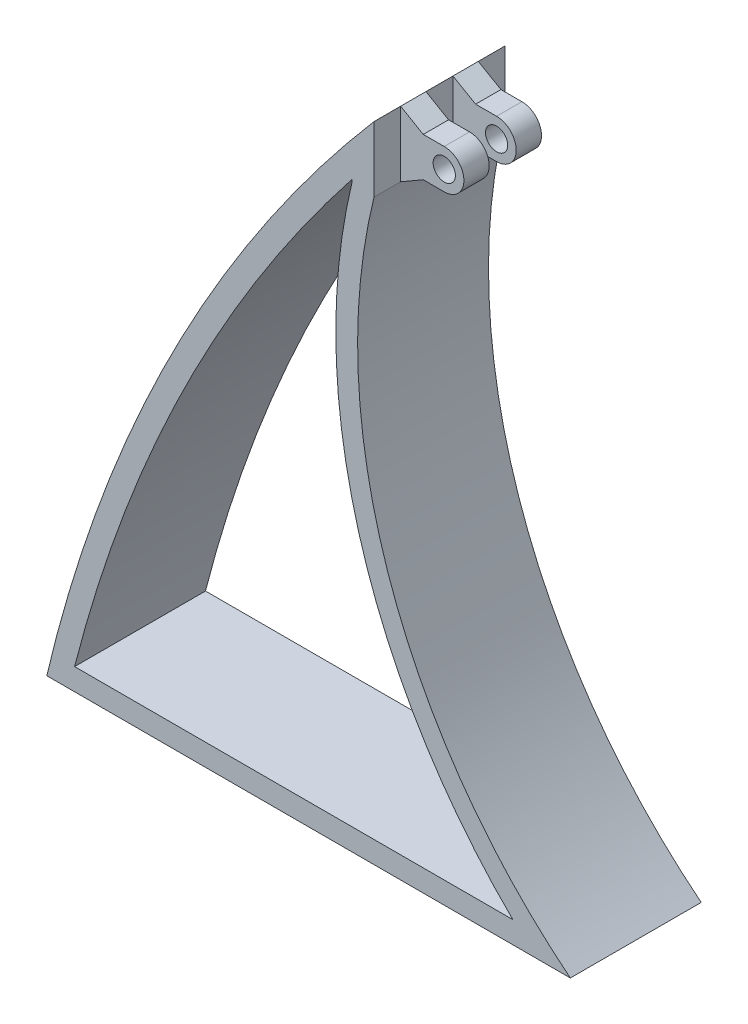
ISO-10303-21;
HEADER;
FILE_DESCRIPTION(('STEP AP214'),'2;1');
FILE_NAME('part.step','',(''),(''),'','','');
FILE_SCHEMA(('AUTOMOTIVE_DESIGN { 1 0 10303 214 1 1 1 1 }'));
ENDSEC;
DATA;
#1=APPLICATION_CONTEXT('core data for automotive mechanical design processes');
#2=APPLICATION_PROTOCOL_DEFINITION('international standard','automotive_design',2000,#1);
#3=PRODUCT_CONTEXT('',#1,'mechanical');
#4=PRODUCT('Part','Part','',(#3));
#5=PRODUCT_RELATED_PRODUCT_CATEGORY('part','',(#4));
#6=PRODUCT_DEFINITION_FORMATION('','',#4);
#7=PRODUCT_DEFINITION_CONTEXT('part definition',#1,'design');
#8=PRODUCT_DEFINITION('design','',#6,#7);
#9=PRODUCT_DEFINITION_SHAPE('','',#8);
#10=(LENGTH_UNIT() NAMED_UNIT(*) SI_UNIT(.MILLI.,.METRE.));
#11=(NAMED_UNIT(*) PLANE_ANGLE_UNIT() SI_UNIT($,.RADIAN.));
#12=(NAMED_UNIT(*) SI_UNIT($,.STERADIAN.) SOLID_ANGLE_UNIT());
#13=UNCERTAINTY_MEASURE_WITH_UNIT(LENGTH_MEASURE(1.E-05),#10,'distance_accuracy_value','');
#14=(GEOMETRIC_REPRESENTATION_CONTEXT(3) GLOBAL_UNCERTAINTY_ASSIGNED_CONTEXT((#13)) GLOBAL_UNIT_ASSIGNED_CONTEXT((#10,
#11,#12)) REPRESENTATION_CONTEXT('',''));
#15=CARTESIAN_POINT('',(0.,0.,0.));
#16=DIRECTION('',(0.,0.,1.));
#17=DIRECTION('',(1.,0.,0.));
#18=AXIS2_PLACEMENT_3D('',#15,#16,#17);
#19=CARTESIAN_POINT('',(15.,0.,15.));
#20=DIRECTION('',(1.,0.,0.));
#21=DIRECTION('',(0.,1.,0.));
#22=AXIS2_PLACEMENT_3D('',#19,#20,#21);
#23=PLANE('',#22);
#24=DIRECTION('',(0.,0.,-1.));
#25=VECTOR('',#24,1.);
#26=CARTESIAN_POINT('',(15.,147.5,15.));
#27=LINE('',#26,#25);
#28=CARTESIAN_POINT('',(15.,147.5,-8.9));
#29=VERTEX_POINT('',#28);
#30=CARTESIAN_POINT('',(15.,147.5,-15.));
#31=VERTEX_POINT('',#30);
#32=EDGE_CURVE('E405',#29,#31,#27,.T.);
#33=ORIENTED_EDGE('',*,*,#32,.F.);
#34=DIRECTION('',(0.,-1.,0.));
#35=VECTOR('',#34,1.);
#36=CARTESIAN_POINT('',(15.,147.5,-8.9));
#37=LINE('',#36,#35);
#38=CARTESIAN_POINT('',(15.,132.5,-8.9));
#39=VERTEX_POINT('',#38);
#40=EDGE_CURVE('E60',#29,#39,#37,.T.);
#41=ORIENTED_EDGE('',*,*,#40,.T.);
#42=DIRECTION('',(0.,0.,-1.));
#43=VECTOR('',#42,1.);
#44=CARTESIAN_POINT('',(15.,132.5,15.));
#45=LINE('',#44,#43);
#46=CARTESIAN_POINT('',(15.,132.5,-15.));
#47=VERTEX_POINT('',#46);
#48=EDGE_CURVE('E53',#39,#47,#45,.T.);
#49=ORIENTED_EDGE('',*,*,#48,.T.);
#50=DIRECTION('',(0.,-1.,0.));
#51=VECTOR('',#50,1.);
#52=CARTESIAN_POINT('',(15.,0.,-15.));
#53=LINE('',#52,#51);
#54=EDGE_CURVE('E390',#31,#47,#53,.T.);
#55=ORIENTED_EDGE('',*,*,#54,.F.);
#56=EDGE_LOOP('',(#33,#41,#49,#55));
#57=FACE_BOUND('',#56,.T.);
#58=ADVANCED_FACE('F43',(#57),#23,.T.);
#59=CARTESIAN_POINT('',(15.,132.5,15.));
#60=VERTEX_POINT('',#59);
#61=CARTESIAN_POINT('',(15.,132.5,8.9));
#62=VERTEX_POINT('',#61);
#63=EDGE_CURVE('E11',#60,#62,#45,.T.);
#64=ORIENTED_EDGE('',*,*,#63,.T.);
#65=DIRECTION('',(0.,-1.,0.));
#66=VECTOR('',#65,1.);
#67=CARTESIAN_POINT('',(15.,147.5,8.9));
#68=LINE('',#67,#66);
#69=CARTESIAN_POINT('',(15.,147.5,8.9));
#70=VERTEX_POINT('',#69);
#71=EDGE_CURVE('E271',#70,#62,#68,.T.);
#72=ORIENTED_EDGE('',*,*,#71,.F.);
#73=CARTESIAN_POINT('',(15.,147.5,15.));
#74=VERTEX_POINT('',#73);
#75=EDGE_CURVE('E406',#74,#70,#27,.T.);
#76=ORIENTED_EDGE('',*,*,#75,.F.);
#77=DIRECTION('',(0.,-1.,0.));
#78=VECTOR('',#77,1.);
#79=CARTESIAN_POINT('',(15.,0.,15.));
#80=LINE('',#79,#78);
#81=EDGE_CURVE('E375',#74,#60,#80,.T.);
#82=ORIENTED_EDGE('',*,*,#81,.T.);
#83=EDGE_LOOP('',(#64,#72,#76,#82));
#84=FACE_BOUND('',#83,.T.);
#85=ADVANCED_FACE('F437',(#84),#23,.T.);
#86=CARTESIAN_POINT('',(141.245938029767,101.484469519544,15.));
#87=DIRECTION('',(0.,0.,-1.));
#88=DIRECTION('',(-1.,0.,0.));
#89=AXIS2_PLACEMENT_3D('',#86,#87,#88);
#90=CYLINDRICAL_SURFACE('',#89,130.);
#91=CARTESIAN_POINT('',(141.245938029767,101.484469519544,-15.));
#92=DIRECTION('',(0.,0.,1.));
#93=DIRECTION('',(1.,0.,0.));
#94=AXIS2_PLACEMENT_3D('',#91,#92,#93);
#95=CIRCLE('',#94,130.);
#96=CARTESIAN_POINT('',(60.,0.,-15.));
#97=VERTEX_POINT('',#96);
#98=EDGE_CURVE('E361',#47,#97,#95,.T.);
#99=ORIENTED_EDGE('',*,*,#98,.F.);
#100=ORIENTED_EDGE('',*,*,#48,.F.);
#101=DIRECTION('',(0.,0.,1.));
#102=VECTOR('',#101,1.);
#103=CARTESIAN_POINT('',(15.,132.5,-8.9));
#104=LINE('',#103,#102);
#105=CARTESIAN_POINT('',(15.,132.5,-3.1));
#106=VERTEX_POINT('',#105);
#107=EDGE_CURVE('E249',#39,#106,#104,.T.);
#108=ORIENTED_EDGE('',*,*,#107,.T.);
#109=CARTESIAN_POINT('',(15.,132.5,3.1));
#110=VERTEX_POINT('',#109);
#111=EDGE_CURVE('E52',#110,#106,#45,.T.);
#112=ORIENTED_EDGE('',*,*,#111,.F.);
#113=DIRECTION('',(0.,0.,-1.));
#114=VECTOR('',#113,1.);
#115=CARTESIAN_POINT('',(15.,132.5,8.9));
#116=LINE('',#115,#114);
#117=EDGE_CURVE('E319',#62,#110,#116,.T.);
#118=ORIENTED_EDGE('',*,*,#117,.F.);
#119=ORIENTED_EDGE('',*,*,#63,.F.);
#120=CARTESIAN_POINT('',(141.245938029767,101.484469519544,15.));
#121=DIRECTION('',(0.,0.,1.));
#122=DIRECTION('',(1.,0.,0.));
#123=AXIS2_PLACEMENT_3D('',#120,#121,#122);
#124=CIRCLE('',#123,130.);
#125=CARTESIAN_POINT('',(60.,0.,15.));
#126=VERTEX_POINT('',#125);
#127=EDGE_CURVE('E371',#60,#126,#124,.T.);
#128=ORIENTED_EDGE('',*,*,#127,.T.);
#129=DIRECTION('',(0.,0.,-1.));
#130=VECTOR('',#129,1.);
#131=CARTESIAN_POINT('',(60.,0.,15.));
#132=LINE('',#131,#130);
#133=EDGE_CURVE('E386',#126,#97,#132,.T.);
#134=ORIENTED_EDGE('',*,*,#133,.T.);
#135=EDGE_LOOP('',(#99,#100,#108,#112,#118,#119,#128,#134));
#136=FACE_BOUND('',#135,.T.);
#137=ADVANCED_FACE('F45',(#136),#90,.F.);
#138=DIRECTION('',(0.,-1.,0.));
#139=VECTOR('',#138,1.);
#140=CARTESIAN_POINT('',(15.,147.5,-3.1));
#141=LINE('',#140,#139);
#142=CARTESIAN_POINT('',(15.,147.5,-3.1));
#143=VERTEX_POINT('',#142);
#144=EDGE_CURVE('E205',#143,#106,#141,.T.);
#145=ORIENTED_EDGE('',*,*,#144,.F.);
#146=CARTESIAN_POINT('',(15.,147.5,3.1));
#147=VERTEX_POINT('',#146);
#148=EDGE_CURVE('E409',#147,#143,#27,.T.);
#149=ORIENTED_EDGE('',*,*,#148,.F.);
#150=DIRECTION('',(0.,-1.,0.));
#151=VECTOR('',#150,1.);
#152=CARTESIAN_POINT('',(15.,147.5,3.1));
#153=LINE('',#152,#151);
#154=EDGE_CURVE('E290',#147,#110,#153,.T.);
#155=ORIENTED_EDGE('',*,*,#154,.T.);
#156=ORIENTED_EDGE('',*,*,#111,.T.);
#157=EDGE_LOOP('',(#145,#149,#155,#156));
#158=FACE_BOUND('',#157,.T.);
#159=ADVANCED_FACE('F455',(#158),#23,.T.);
#160=CARTESIAN_POINT('',(280.642623476707,-80.3903170220544,15.));
#161=DIRECTION('',(0.,0.,-1.));
#162=DIRECTION('',(-1.,0.,0.));
#163=AXIS2_PLACEMENT_3D('',#160,#161,#162);
#164=CYLINDRICAL_SURFACE('',#163,350.);
#165=CARTESIAN_POINT('',(280.642623476707,-80.3903170220544,-15.));
#166=DIRECTION('',(0.,0.,1.));
#167=DIRECTION('',(1.,0.,0.));
#168=AXIS2_PLACEMENT_3D('',#165,#166,#167);
#169=CIRCLE('',#168,350.);
#170=CARTESIAN_POINT('',(-60.,0.,-15.));
#171=VERTEX_POINT('',#170);
#172=EDGE_CURVE('E394',#31,#171,#169,.T.);
#173=ORIENTED_EDGE('',*,*,#172,.T.);
#174=DIRECTION('',(0.,0.,-1.));
#175=VECTOR('',#174,1.);
#176=CARTESIAN_POINT('',(-60.,0.,15.));
#177=LINE('',#176,#175);
#178=CARTESIAN_POINT('',(-60.,0.,15.));
#179=VERTEX_POINT('',#178);
#180=EDGE_CURVE('E402',#179,#171,#177,.T.);
#181=ORIENTED_EDGE('',*,*,#180,.F.);
#182=CARTESIAN_POINT('',(280.642623476707,-80.3903170220544,15.));
#183=DIRECTION('',(0.,0.,1.));
#184=DIRECTION('',(1.,0.,0.));
#185=AXIS2_PLACEMENT_3D('',#182,#183,#184);
#186=CIRCLE('',#185,350.);
#187=EDGE_CURVE('E380',#74,#179,#186,.T.);
#188=ORIENTED_EDGE('',*,*,#187,.F.);
#189=ORIENTED_EDGE('',*,*,#75,.T.);
#190=DIRECTION('',(0.,0.,-1.));
#191=VECTOR('',#190,1.);
#192=CARTESIAN_POINT('',(15.,147.5,8.9));
#193=LINE('',#192,#191);
#194=EDGE_CURVE('E322',#70,#147,#193,.T.);
#195=ORIENTED_EDGE('',*,*,#194,.T.);
#196=ORIENTED_EDGE('',*,*,#148,.T.);
#197=DIRECTION('',(0.,0.,1.));
#198=VECTOR('',#197,1.);
#199=CARTESIAN_POINT('',(15.,147.5,-8.9));
#200=LINE('',#199,#198);
#201=EDGE_CURVE('E225',#29,#143,#200,.T.);
#202=ORIENTED_EDGE('',*,*,#201,.F.);
#203=ORIENTED_EDGE('',*,*,#32,.T.);
#204=EDGE_LOOP('',(#173,#181,#188,#189,#195,#196,#202,#203));
#205=FACE_BOUND('',#204,.T.);
#206=ADVANCED_FACE('F418',(#205),#164,.T.);
#207=CARTESIAN_POINT('',(0.,0.,15.));
#208=DIRECTION('',(0.,1.,0.));
#209=DIRECTION('',(0.,0.,1.));
#210=AXIS2_PLACEMENT_3D('',#207,#208,#209);
#211=PLANE('',#210);
#212=DIRECTION('',(1.,0.,0.));
#213=VECTOR('',#212,1.);
#214=CARTESIAN_POINT('',(0.,0.,-15.));
#215=LINE('',#214,#213);
#216=EDGE_CURVE('E376',#171,#97,#215,.T.);
#217=ORIENTED_EDGE('',*,*,#216,.T.);
#218=ORIENTED_EDGE('',*,*,#133,.F.);
#219=DIRECTION('',(1.,0.,0.));
#220=VECTOR('',#219,1.);
#221=CARTESIAN_POINT('',(0.,0.,15.));
#222=LINE('',#221,#220);
#223=EDGE_CURVE('E383',#179,#126,#222,.T.);
#224=ORIENTED_EDGE('',*,*,#223,.F.);
#225=ORIENTED_EDGE('',*,*,#180,.T.);
#226=EDGE_LOOP('',(#217,#218,#224,#225));
#227=FACE_BOUND('',#226,.T.);
#228=ADVANCED_FACE('F432',(#227),#211,.F.);
#229=CARTESIAN_POINT('',(0.,0.,15.));
#230=DIRECTION('',(0.,0.,1.));
#231=DIRECTION('',(1.,0.,0.));
#232=AXIS2_PLACEMENT_3D('',#229,#230,#231);
#233=PLANE('',#232);
#234=CARTESIAN_POINT('',(141.245938029767,101.484469519544,15.));
#235=DIRECTION('',(0.,0.,-1.));
#236=DIRECTION('',(1.,0.,0.));
#237=AXIS2_PLACEMENT_3D('',#234,#235,#236);
#238=CIRCLE('',#237,135.);
#239=CARTESIAN_POINT('',(46.8227039105516,5.,15.));
#240=VERTEX_POINT('',#239);
#241=CARTESIAN_POINT('',(9.99999999999998,133.099398756954,15.));
#242=VERTEX_POINT('',#241);
#243=EDGE_CURVE('E326',#240,#242,#238,.T.);
#244=ORIENTED_EDGE('',*,*,#243,.F.);
#245=DIRECTION('',(1.,0.,0.));
#246=VECTOR('',#245,1.);
#247=CARTESIAN_POINT('',(-53.6229801364572,5.,15.));
#248=LINE('',#247,#246);
#249=CARTESIAN_POINT('',(-53.6229801364572,4.99999999999995,15.));
#250=VERTEX_POINT('',#249);
#251=EDGE_CURVE('E332',#250,#240,#248,.T.);
#252=ORIENTED_EDGE('',*,*,#251,.F.);
#253=CARTESIAN_POINT('',(280.642623476707,-80.3903170220544,15.));
#254=DIRECTION('',(0.,0.,1.));
#255=DIRECTION('',(1.,0.,0.));
#256=AXIS2_PLACEMENT_3D('',#253,#254,#255);
#257=CIRCLE('',#256,345.);
#258=CARTESIAN_POINT('',(9.99999999999998,133.56661873289,15.));
#259=VERTEX_POINT('',#258);
#260=EDGE_CURVE('E351',#259,#250,#257,.T.);
#261=ORIENTED_EDGE('',*,*,#260,.F.);
#262=DIRECTION('',(0.,1.,0.));
#263=VECTOR('',#262,1.);
#264=CARTESIAN_POINT('',(9.99999999999998,133.099398756954,15.));
#265=LINE('',#264,#263);
#266=EDGE_CURVE('E347',#242,#259,#265,.T.);
#267=ORIENTED_EDGE('',*,*,#266,.F.);
#268=EDGE_LOOP('',(#244,#252,#261,#267));
#269=FACE_BOUND('',#268,.T.);
#270=ORIENTED_EDGE('',*,*,#127,.F.);
#271=ORIENTED_EDGE('',*,*,#81,.F.);
#272=ORIENTED_EDGE('',*,*,#187,.T.);
#273=ORIENTED_EDGE('',*,*,#223,.T.);
#274=EDGE_LOOP('',(#270,#271,#272,#273));
#275=FACE_BOUND('',#274,.T.);
#276=ADVANCED_FACE('F435',(#269,#275),#233,.T.);
#277=CARTESIAN_POINT('',(0.,0.,-15.));
#278=DIRECTION('',(0.,0.,1.));
#279=DIRECTION('',(1.,0.,0.));
#280=AXIS2_PLACEMENT_3D('',#277,#278,#279);
#281=PLANE('',#280);
#282=DIRECTION('',(1.,0.,0.));
#283=VECTOR('',#282,1.);
#284=CARTESIAN_POINT('',(-53.6229801364572,5.,-15.));
#285=LINE('',#284,#283);
#286=CARTESIAN_POINT('',(-53.6229801364572,4.99999999999995,-15.));
#287=VERTEX_POINT('',#286);
#288=CARTESIAN_POINT('',(46.8227039105516,5.,-15.));
#289=VERTEX_POINT('',#288);
#290=EDGE_CURVE('E340',#287,#289,#285,.T.);
#291=ORIENTED_EDGE('',*,*,#290,.T.);
#292=CARTESIAN_POINT('',(141.245938029767,101.484469519544,-15.));
#293=DIRECTION('',(0.,0.,-1.));
#294=DIRECTION('',(1.,0.,0.));
#295=AXIS2_PLACEMENT_3D('',#292,#293,#294);
#296=CIRCLE('',#295,135.);
#297=CARTESIAN_POINT('',(9.99999999999998,133.099398756954,-15.));
#298=VERTEX_POINT('',#297);
#299=EDGE_CURVE('E327',#289,#298,#296,.T.);
#300=ORIENTED_EDGE('',*,*,#299,.T.);
#301=DIRECTION('',(0.,1.,0.));
#302=VECTOR('',#301,1.);
#303=CARTESIAN_POINT('',(9.99999999999998,133.099398756954,-15.));
#304=LINE('',#303,#302);
#305=CARTESIAN_POINT('',(9.99999999999998,133.56661873289,-15.));
#306=VERTEX_POINT('',#305);
#307=EDGE_CURVE('E331',#298,#306,#304,.T.);
#308=ORIENTED_EDGE('',*,*,#307,.T.);
#309=CARTESIAN_POINT('',(280.642623476707,-80.3903170220544,-15.));
#310=DIRECTION('',(0.,0.,1.));
#311=DIRECTION('',(1.,0.,0.));
#312=AXIS2_PLACEMENT_3D('',#309,#310,#311);
#313=CIRCLE('',#312,345.);
#314=EDGE_CURVE('E336',#306,#287,#313,.T.);
#315=ORIENTED_EDGE('',*,*,#314,.T.);
#316=EDGE_LOOP('',(#291,#300,#308,#315));
#317=FACE_BOUND('',#316,.T.);
#318=ORIENTED_EDGE('',*,*,#98,.T.);
#319=ORIENTED_EDGE('',*,*,#216,.F.);
#320=ORIENTED_EDGE('',*,*,#172,.F.);
#321=ORIENTED_EDGE('',*,*,#54,.T.);
#322=EDGE_LOOP('',(#318,#319,#320,#321));
#323=FACE_BOUND('',#322,.T.);
#324=ADVANCED_FACE('F424',(#317,#323),#281,.F.);
#325=CARTESIAN_POINT('',(141.245938029767,101.484469519544,-15.));
#326=DIRECTION('',(0.,0.,1.));
#327=DIRECTION('',(1.,0.,0.));
#328=AXIS2_PLACEMENT_3D('',#325,#326,#327);
#329=CYLINDRICAL_SURFACE('',#328,135.);
#330=ORIENTED_EDGE('',*,*,#243,.T.);
#331=DIRECTION('',(0.,0.,1.));
#332=VECTOR('',#331,1.);
#333=CARTESIAN_POINT('',(9.99999999999998,133.099398756954,-15.));
#334=LINE('',#333,#332);
#335=EDGE_CURVE('E344',#298,#242,#334,.T.);
#336=ORIENTED_EDGE('',*,*,#335,.F.);
#337=ORIENTED_EDGE('',*,*,#299,.F.);
#338=DIRECTION('',(0.,0.,1.));
#339=VECTOR('',#338,1.);
#340=CARTESIAN_POINT('',(46.8227039105516,5.,-15.));
#341=LINE('',#340,#339);
#342=EDGE_CURVE('E358',#289,#240,#341,.T.);
#343=ORIENTED_EDGE('',*,*,#342,.T.);
#344=EDGE_LOOP('',(#330,#336,#337,#343));
#345=FACE_BOUND('',#344,.T.);
#346=ADVANCED_FACE('F689',(#345),#329,.T.);
#347=CARTESIAN_POINT('',(-53.6229801364572,5.,-15.));
#348=DIRECTION('',(0.,-1.,0.));
#349=DIRECTION('',(0.,0.,-1.));
#350=AXIS2_PLACEMENT_3D('',#347,#348,#349);
#351=PLANE('',#350);
#352=ORIENTED_EDGE('',*,*,#251,.T.);
#353=ORIENTED_EDGE('',*,*,#342,.F.);
#354=ORIENTED_EDGE('',*,*,#290,.F.);
#355=DIRECTION('',(0.,0.,1.));
#356=VECTOR('',#355,1.);
#357=CARTESIAN_POINT('',(-53.6229801364572,4.99999999999995,-15.));
#358=LINE('',#357,#356);
#359=EDGE_CURVE('E362',#287,#250,#358,.T.);
#360=ORIENTED_EDGE('',*,*,#359,.T.);
#361=EDGE_LOOP('',(#352,#353,#354,#360));
#362=FACE_BOUND('',#361,.T.);
#363=ADVANCED_FACE('F697',(#362),#351,.F.);
#364=CARTESIAN_POINT('',(280.642623476707,-80.3903170220544,-15.));
#365=DIRECTION('',(0.,0.,1.));
#366=DIRECTION('',(1.,0.,0.));
#367=AXIS2_PLACEMENT_3D('',#364,#365,#366);
#368=CYLINDRICAL_SURFACE('',#367,345.);
#369=ORIENTED_EDGE('',*,*,#260,.T.);
#370=ORIENTED_EDGE('',*,*,#359,.F.);
#371=ORIENTED_EDGE('',*,*,#314,.F.);
#372=DIRECTION('',(0.,0.,1.));
#373=VECTOR('',#372,1.);
#374=CARTESIAN_POINT('',(9.99999999999998,133.56661873289,-15.));
#375=LINE('',#374,#373);
#376=EDGE_CURVE('E365',#306,#259,#375,.T.);
#377=ORIENTED_EDGE('',*,*,#376,.T.);
#378=EDGE_LOOP('',(#369,#370,#371,#377));
#379=FACE_BOUND('',#378,.T.);
#380=ADVANCED_FACE('F705',(#379),#368,.F.);
#381=CARTESIAN_POINT('',(9.99999999999998,133.099398756954,-15.));
#382=DIRECTION('',(1.,0.,0.));
#383=DIRECTION('',(0.,0.,-1.));
#384=AXIS2_PLACEMENT_3D('',#381,#382,#383);
#385=PLANE('',#384);
#386=ORIENTED_EDGE('',*,*,#266,.T.);
#387=ORIENTED_EDGE('',*,*,#376,.F.);
#388=ORIENTED_EDGE('',*,*,#307,.F.);
#389=ORIENTED_EDGE('',*,*,#335,.T.);
#390=EDGE_LOOP('',(#386,#387,#388,#389));
#391=FACE_BOUND('',#390,.T.);
#392=ADVANCED_FACE('F508',(#391),#385,.F.);
#393=CARTESIAN_POINT('',(25.,140.,8.9));
#394=DIRECTION('',(0.,0.,-1.));
#395=DIRECTION('',(-1.,0.,0.));
#396=AXIS2_PLACEMENT_3D('',#393,#394,#395);
#397=PLANE('',#396);
#398=DIRECTION('',(-0.866025403784437,0.500000000000004,0.));
#399=VECTOR('',#398,1.);
#400=CARTESIAN_POINT('',(20.1961524227066,144.5,8.9));
#401=LINE('',#400,#399);
#402=CARTESIAN_POINT('',(20.1961524227066,144.5,8.9));
#403=VERTEX_POINT('',#402);
#404=EDGE_CURVE('E268',#403,#70,#401,.T.);
#405=ORIENTED_EDGE('',*,*,#404,.T.);
#406=ORIENTED_EDGE('',*,*,#71,.T.);
#407=DIRECTION('',(0.866025403784436,0.500000000000004,0.));
#408=VECTOR('',#407,1.);
#409=CARTESIAN_POINT('',(20.1961524227066,135.5,8.9));
#410=LINE('',#409,#408);
#411=CARTESIAN_POINT('',(20.1961524227066,135.5,8.9));
#412=VERTEX_POINT('',#411);
#413=EDGE_CURVE('E275',#62,#412,#410,.T.);
#414=ORIENTED_EDGE('',*,*,#413,.T.);
#415=DIRECTION('',(1.,0.,0.));
#416=VECTOR('',#415,1.);
#417=CARTESIAN_POINT('',(25.,135.5,8.9));
#418=LINE('',#417,#416);
#419=CARTESIAN_POINT('',(25.,135.5,8.9));
#420=VERTEX_POINT('',#419);
#421=EDGE_CURVE('E278',#412,#420,#418,.T.);
#422=ORIENTED_EDGE('',*,*,#421,.T.);
#423=CARTESIAN_POINT('',(25.,140.,8.9));
#424=DIRECTION('',(0.,0.,1.));
#425=DIRECTION('',(-1.,0.,0.));
#426=AXIS2_PLACEMENT_3D('',#423,#424,#425);
#427=CIRCLE('',#426,4.5);
#428=CARTESIAN_POINT('',(25.,144.5,8.9));
#429=VERTEX_POINT('',#428);
#430=EDGE_CURVE('E281',#420,#429,#427,.T.);
#431=ORIENTED_EDGE('',*,*,#430,.T.);
#432=DIRECTION('',(-1.,0.,0.));
#433=VECTOR('',#432,1.);
#434=CARTESIAN_POINT('',(25.,144.5,8.9));
#435=LINE('',#434,#433);
#436=EDGE_CURVE('E284',#429,#403,#435,.T.);
#437=ORIENTED_EDGE('',*,*,#436,.T.);
#438=EDGE_LOOP('',(#405,#406,#414,#422,#431,#437));
#439=FACE_BOUND('',#438,.T.);
#440=CARTESIAN_POINT('',(25.,140.,8.9));
#441=DIRECTION('',(0.,0.,1.));
#442=DIRECTION('',(1.,0.,0.));
#443=AXIS2_PLACEMENT_3D('',#440,#441,#442);
#444=CIRCLE('',#443,2.54999999999999);
#445=CARTESIAN_POINT('',(27.55,140.,8.9));
#446=VERTEX_POINT('',#445);
#447=EDGE_CURVE('E261',#446,#446,#444,.T.);
#448=ORIENTED_EDGE('',*,*,#447,.F.);
#449=EDGE_LOOP('',(#448));
#450=FACE_BOUND('',#449,.T.);
#451=ADVANCED_FACE('F441',(#439,#450),#397,.F.);
#452=CARTESIAN_POINT('',(25.,140.,3.1));
#453=DIRECTION('',(0.,0.,-1.));
#454=DIRECTION('',(-1.,0.,0.));
#455=AXIS2_PLACEMENT_3D('',#452,#453,#454);
#456=PLANE('',#455);
#457=DIRECTION('',(-0.866025403784437,0.500000000000004,0.));
#458=VECTOR('',#457,1.);
#459=CARTESIAN_POINT('',(20.1961524227066,144.5,3.1));
#460=LINE('',#459,#458);
#461=CARTESIAN_POINT('',(20.1961524227066,144.5,3.1));
#462=VERTEX_POINT('',#461);
#463=EDGE_CURVE('E68',#462,#147,#460,.T.);
#464=ORIENTED_EDGE('',*,*,#463,.F.);
#465=DIRECTION('',(-1.,0.,0.));
#466=VECTOR('',#465,1.);
#467=CARTESIAN_POINT('',(25.,144.5,3.1));
#468=LINE('',#467,#466);
#469=CARTESIAN_POINT('',(25.,144.5,3.1));
#470=VERTEX_POINT('',#469);
#471=EDGE_CURVE('E272',#470,#462,#468,.T.);
#472=ORIENTED_EDGE('',*,*,#471,.F.);
#473=CARTESIAN_POINT('',(25.,140.,3.1));
#474=DIRECTION('',(0.,0.,1.));
#475=DIRECTION('',(-1.,0.,0.));
#476=AXIS2_PLACEMENT_3D('',#473,#474,#475);
#477=CIRCLE('',#476,4.5);
#478=CARTESIAN_POINT('',(25.,135.5,3.1));
#479=VERTEX_POINT('',#478);
#480=EDGE_CURVE('E300',#479,#470,#477,.T.);
#481=ORIENTED_EDGE('',*,*,#480,.F.);
#482=DIRECTION('',(1.,0.,0.));
#483=VECTOR('',#482,1.);
#484=CARTESIAN_POINT('',(25.,135.5,3.1));
#485=LINE('',#484,#483);
#486=CARTESIAN_POINT('',(20.1961524227066,135.5,3.1));
#487=VERTEX_POINT('',#486);
#488=EDGE_CURVE('E297',#487,#479,#485,.T.);
#489=ORIENTED_EDGE('',*,*,#488,.F.);
#490=DIRECTION('',(0.866025403784436,0.500000000000004,0.));
#491=VECTOR('',#490,1.);
#492=CARTESIAN_POINT('',(20.1961524227066,135.5,3.1));
#493=LINE('',#492,#491);
#494=EDGE_CURVE('E294',#110,#487,#493,.T.);
#495=ORIENTED_EDGE('',*,*,#494,.F.);
#496=ORIENTED_EDGE('',*,*,#154,.F.);
#497=EDGE_LOOP('',(#464,#472,#481,#489,#495,#496));
#498=FACE_BOUND('',#497,.T.);
#499=CARTESIAN_POINT('',(25.,140.,3.1));
#500=DIRECTION('',(0.,0.,1.));
#501=DIRECTION('',(1.,0.,0.));
#502=AXIS2_PLACEMENT_3D('',#499,#500,#501);
#503=CIRCLE('',#502,2.54999999999999);
#504=CARTESIAN_POINT('',(27.55,140.,3.1));
#505=VERTEX_POINT('',#504);
#506=EDGE_CURVE('E196',#505,#505,#503,.T.);
#507=ORIENTED_EDGE('',*,*,#506,.T.);
#508=EDGE_LOOP('',(#507));
#509=FACE_BOUND('',#508,.T.);
#510=ADVANCED_FACE('F458',(#498,#509),#456,.T.);
#511=CARTESIAN_POINT('',(20.1961524227066,144.5,8.9));
#512=DIRECTION('',(-0.500000000000004,-0.866025403784436,0.));
#513=DIRECTION('',(0.866025403784437,-0.500000000000004,0.));
#514=AXIS2_PLACEMENT_3D('',#511,#512,#513);
#515=PLANE('',#514);
#516=ORIENTED_EDGE('',*,*,#463,.T.);
#517=ORIENTED_EDGE('',*,*,#194,.F.);
#518=ORIENTED_EDGE('',*,*,#404,.F.);
#519=DIRECTION('',(0.,0.,-1.));
#520=VECTOR('',#519,1.);
#521=CARTESIAN_POINT('',(20.1961524227066,144.5,8.9));
#522=LINE('',#521,#520);
#523=EDGE_CURVE('E287',#403,#462,#522,.T.);
#524=ORIENTED_EDGE('',*,*,#523,.T.);
#525=EDGE_LOOP('',(#516,#517,#518,#524));
#526=FACE_BOUND('',#525,.T.);
#527=ADVANCED_FACE('F474',(#526),#515,.F.);
#528=CARTESIAN_POINT('',(20.1961524227066,135.5,8.9));
#529=DIRECTION('',(-0.500000000000004,0.866025403784436,0.));
#530=DIRECTION('',(-0.866025403784436,-0.500000000000004,0.));
#531=AXIS2_PLACEMENT_3D('',#528,#529,#530);
#532=PLANE('',#531);
#533=ORIENTED_EDGE('',*,*,#494,.T.);
#534=DIRECTION('',(0.,0.,-1.));
#535=VECTOR('',#534,1.);
#536=CARTESIAN_POINT('',(20.1961524227066,135.5,8.9));
#537=LINE('',#536,#535);
#538=EDGE_CURVE('E315',#412,#487,#537,.T.);
#539=ORIENTED_EDGE('',*,*,#538,.F.);
#540=ORIENTED_EDGE('',*,*,#413,.F.);
#541=ORIENTED_EDGE('',*,*,#117,.T.);
#542=EDGE_LOOP('',(#533,#539,#540,#541));
#543=FACE_BOUND('',#542,.T.);
#544=ADVANCED_FACE('F447',(#543),#532,.F.);
#545=CARTESIAN_POINT('',(25.,135.5,8.9));
#546=DIRECTION('',(0.,1.,0.));
#547=DIRECTION('',(0.,0.,1.));
#548=AXIS2_PLACEMENT_3D('',#545,#546,#547);
#549=PLANE('',#548);
#550=ORIENTED_EDGE('',*,*,#488,.T.);
#551=DIRECTION('',(0.,0.,-1.));
#552=VECTOR('',#551,1.);
#553=CARTESIAN_POINT('',(25.,135.5,8.9));
#554=LINE('',#553,#552);
#555=EDGE_CURVE('E311',#420,#479,#554,.T.);
#556=ORIENTED_EDGE('',*,*,#555,.F.);
#557=ORIENTED_EDGE('',*,*,#421,.F.);
#558=ORIENTED_EDGE('',*,*,#538,.T.);
#559=EDGE_LOOP('',(#550,#556,#557,#558));
#560=FACE_BOUND('',#559,.T.);
#561=ADVANCED_FACE('F464',(#560),#549,.F.);
#562=CARTESIAN_POINT('',(25.,140.,8.9));
#563=DIRECTION('',(0.,0.,-1.));
#564=DIRECTION('',(-1.,0.,0.));
#565=AXIS2_PLACEMENT_3D('',#562,#563,#564);
#566=CYLINDRICAL_SURFACE('',#565,4.5);
#567=ORIENTED_EDGE('',*,*,#480,.T.);
#568=DIRECTION('',(0.,0.,-1.));
#569=VECTOR('',#568,1.);
#570=CARTESIAN_POINT('',(25.,144.5,8.9));
#571=LINE('',#570,#569);
#572=EDGE_CURVE('E307',#429,#470,#571,.T.);
#573=ORIENTED_EDGE('',*,*,#572,.F.);
#574=ORIENTED_EDGE('',*,*,#430,.F.);
#575=ORIENTED_EDGE('',*,*,#555,.T.);
#576=EDGE_LOOP('',(#567,#573,#574,#575));
#577=FACE_BOUND('',#576,.T.);
#578=ADVANCED_FACE('F471',(#577),#566,.T.);
#579=CARTESIAN_POINT('',(25.,144.5,8.9));
#580=DIRECTION('',(0.,-1.,0.));
#581=DIRECTION('',(0.,0.,-1.));
#582=AXIS2_PLACEMENT_3D('',#579,#580,#581);
#583=PLANE('',#582);
#584=ORIENTED_EDGE('',*,*,#471,.T.);
#585=ORIENTED_EDGE('',*,*,#523,.F.);
#586=ORIENTED_EDGE('',*,*,#436,.F.);
#587=ORIENTED_EDGE('',*,*,#572,.T.);
#588=EDGE_LOOP('',(#584,#585,#586,#587));
#589=FACE_BOUND('',#588,.T.);
#590=ADVANCED_FACE('F473',(#589),#583,.F.);
#591=CARTESIAN_POINT('',(25.,140.,8.9));
#592=DIRECTION('',(0.,0.,-1.));
#593=DIRECTION('',(-1.,0.,0.));
#594=AXIS2_PLACEMENT_3D('',#591,#592,#593);
#595=CYLINDRICAL_SURFACE('',#594,2.54999999999999);
#596=ORIENTED_EDGE('',*,*,#447,.T.);
#597=EDGE_LOOP('',(#596));
#598=FACE_BOUND('',#597,.T.);
#599=ORIENTED_EDGE('',*,*,#506,.F.);
#600=EDGE_LOOP('',(#599));
#601=FACE_BOUND('',#600,.T.);
#602=ADVANCED_FACE('F555',(#598,#601),#595,.F.);
#603=CARTESIAN_POINT('',(20.1961524227066,144.5,-8.9));
#604=DIRECTION('',(0.500000000000004,0.866025403784436,0.));
#605=DIRECTION('',(-0.866025403784437,0.500000000000004,0.));
#606=AXIS2_PLACEMENT_3D('',#603,#604,#605);
#607=PLANE('',#606);
#608=DIRECTION('',(-0.866025403784437,0.500000000000004,0.));
#609=VECTOR('',#608,1.);
#610=CARTESIAN_POINT('',(20.1961524227066,144.5,-3.1));
#611=LINE('',#610,#609);
#612=CARTESIAN_POINT('',(20.1961524227066,144.5,-3.1));
#613=VERTEX_POINT('',#612);
#614=EDGE_CURVE('E190',#613,#143,#611,.T.);
#615=ORIENTED_EDGE('',*,*,#614,.F.);
#616=DIRECTION('',(0.,0.,1.));
#617=VECTOR('',#616,1.);
#618=CARTESIAN_POINT('',(20.1961524227066,144.5,-8.9));
#619=LINE('',#618,#617);
#620=CARTESIAN_POINT('',(20.1961524227066,144.5,-8.9));
#621=VERTEX_POINT('',#620);
#622=EDGE_CURVE('E185',#621,#613,#619,.T.);
#623=ORIENTED_EDGE('',*,*,#622,.F.);
#624=DIRECTION('',(-0.866025403784437,0.500000000000004,0.));
#625=VECTOR('',#624,1.);
#626=CARTESIAN_POINT('',(20.1961524227066,144.5,-8.9));
#627=LINE('',#626,#625);
#628=EDGE_CURVE('E187',#621,#29,#627,.T.);
#629=ORIENTED_EDGE('',*,*,#628,.T.);
#630=ORIENTED_EDGE('',*,*,#201,.T.);
#631=EDGE_LOOP('',(#615,#623,#629,#630));
#632=FACE_BOUND('',#631,.T.);
#633=ADVANCED_FACE('F186',(#632),#607,.T.);
#634=CARTESIAN_POINT('',(25.,144.5,-8.9));
#635=DIRECTION('',(0.,1.,0.));
#636=DIRECTION('',(0.,0.,1.));
#637=AXIS2_PLACEMENT_3D('',#634,#635,#636);
#638=PLANE('',#637);
#639=DIRECTION('',(-1.,0.,0.));
#640=VECTOR('',#639,1.);
#641=CARTESIAN_POINT('',(25.,144.5,-3.1));
#642=LINE('',#641,#640);
#643=CARTESIAN_POINT('',(25.,144.5,-3.1));
#644=VERTEX_POINT('',#643);
#645=EDGE_CURVE('E228',#644,#613,#642,.T.);
#646=ORIENTED_EDGE('',*,*,#645,.F.);
#647=DIRECTION('',(0.,0.,1.));
#648=VECTOR('',#647,1.);
#649=CARTESIAN_POINT('',(25.,144.5,-8.9));
#650=LINE('',#649,#648);
#651=CARTESIAN_POINT('',(25.,144.5,-8.9));
#652=VERTEX_POINT('',#651);
#653=EDGE_CURVE('E197',#652,#644,#650,.T.);
#654=ORIENTED_EDGE('',*,*,#653,.F.);
#655=DIRECTION('',(-1.,0.,0.));
#656=VECTOR('',#655,1.);
#657=CARTESIAN_POINT('',(25.,144.5,-8.9));
#658=LINE('',#657,#656);
#659=EDGE_CURVE('E202',#652,#621,#658,.T.);
#660=ORIENTED_EDGE('',*,*,#659,.T.);
#661=ORIENTED_EDGE('',*,*,#622,.T.);
#662=EDGE_LOOP('',(#646,#654,#660,#661));
#663=FACE_BOUND('',#662,.T.);
#664=ADVANCED_FACE('F207',(#663),#638,.T.);
#665=CARTESIAN_POINT('',(25.,140.,-8.9));
#666=DIRECTION('',(0.,0.,1.));
#667=DIRECTION('',(1.,0.,0.));
#668=AXIS2_PLACEMENT_3D('',#665,#666,#667);
#669=CYLINDRICAL_SURFACE('',#668,4.5);
#670=CARTESIAN_POINT('',(25.,140.,-3.1));
#671=DIRECTION('',(0.,0.,1.));
#672=DIRECTION('',(-1.,0.,0.));
#673=AXIS2_PLACEMENT_3D('',#670,#671,#672);
#674=CIRCLE('',#673,4.5);
#675=CARTESIAN_POINT('',(25.,135.5,-3.1));
#676=VERTEX_POINT('',#675);
#677=EDGE_CURVE('E232',#676,#644,#674,.T.);
#678=ORIENTED_EDGE('',*,*,#677,.F.);
#679=DIRECTION('',(0.,0.,1.));
#680=VECTOR('',#679,1.);
#681=CARTESIAN_POINT('',(25.,135.5,-8.9));
#682=LINE('',#681,#680);
#683=CARTESIAN_POINT('',(25.,135.5,-8.9));
#684=VERTEX_POINT('',#683);
#685=EDGE_CURVE('E256',#684,#676,#682,.T.);
#686=ORIENTED_EDGE('',*,*,#685,.F.);
#687=CARTESIAN_POINT('',(25.,140.,-8.9));
#688=DIRECTION('',(0.,0.,1.));
#689=DIRECTION('',(-1.,0.,0.));
#690=AXIS2_PLACEMENT_3D('',#687,#688,#689);
#691=CIRCLE('',#690,4.5);
#692=EDGE_CURVE('E209',#684,#652,#691,.T.);
#693=ORIENTED_EDGE('',*,*,#692,.T.);
#694=ORIENTED_EDGE('',*,*,#653,.T.);
#695=EDGE_LOOP('',(#678,#686,#693,#694));
#696=FACE_BOUND('',#695,.T.);
#697=ADVANCED_FACE('F586',(#696),#669,.T.);
#698=CARTESIAN_POINT('',(25.,135.5,-8.9));
#699=DIRECTION('',(0.,-1.,0.));
#700=DIRECTION('',(0.,0.,-1.));
#701=AXIS2_PLACEMENT_3D('',#698,#699,#700);
#702=PLANE('',#701);
#703=DIRECTION('',(1.,0.,0.));
#704=VECTOR('',#703,1.);
#705=CARTESIAN_POINT('',(25.,135.5,-3.1));
#706=LINE('',#705,#704);
#707=CARTESIAN_POINT('',(20.1961524227066,135.5,-3.1));
#708=VERTEX_POINT('',#707);
#709=EDGE_CURVE('E236',#708,#676,#706,.T.);
#710=ORIENTED_EDGE('',*,*,#709,.F.);
#711=DIRECTION('',(0.,0.,1.));
#712=VECTOR('',#711,1.);
#713=CARTESIAN_POINT('',(20.1961524227066,135.5,-8.9));
#714=LINE('',#713,#712);
#715=CARTESIAN_POINT('',(20.1961524227066,135.5,-8.9));
#716=VERTEX_POINT('',#715);
#717=EDGE_CURVE('E253',#716,#708,#714,.T.);
#718=ORIENTED_EDGE('',*,*,#717,.F.);
#719=DIRECTION('',(1.,0.,0.));
#720=VECTOR('',#719,1.);
#721=CARTESIAN_POINT('',(25.,135.5,-8.9));
#722=LINE('',#721,#720);
#723=EDGE_CURVE('E212',#716,#684,#722,.T.);
#724=ORIENTED_EDGE('',*,*,#723,.T.);
#725=ORIENTED_EDGE('',*,*,#685,.T.);
#726=EDGE_LOOP('',(#710,#718,#724,#725));
#727=FACE_BOUND('',#726,.T.);
#728=ADVANCED_FACE('F594',(#727),#702,.T.);
#729=CARTESIAN_POINT('',(20.1961524227066,135.5,-8.9));
#730=DIRECTION('',(0.500000000000004,-0.866025403784436,0.));
#731=DIRECTION('',(0.866025403784436,0.500000000000004,0.));
#732=AXIS2_PLACEMENT_3D('',#729,#730,#731);
#733=PLANE('',#732);
#734=DIRECTION('',(0.866025403784436,0.500000000000004,0.));
#735=VECTOR('',#734,1.);
#736=CARTESIAN_POINT('',(20.1961524227066,135.5,-3.1));
#737=LINE('',#736,#735);
#738=EDGE_CURVE('E240',#106,#708,#737,.T.);
#739=ORIENTED_EDGE('',*,*,#738,.F.);
#740=ORIENTED_EDGE('',*,*,#107,.F.);
#741=DIRECTION('',(0.866025403784436,0.500000000000004,0.));
#742=VECTOR('',#741,1.);
#743=CARTESIAN_POINT('',(20.1961524227066,135.5,-8.9));
#744=LINE('',#743,#742);
#745=EDGE_CURVE('E219',#39,#716,#744,.T.);
#746=ORIENTED_EDGE('',*,*,#745,.T.);
#747=ORIENTED_EDGE('',*,*,#717,.T.);
#748=EDGE_LOOP('',(#739,#740,#746,#747));
#749=FACE_BOUND('',#748,.T.);
#750=ADVANCED_FACE('F603',(#749),#733,.T.);
#751=CARTESIAN_POINT('',(25.,140.,-8.9));
#752=DIRECTION('',(0.,0.,1.));
#753=DIRECTION('',(-1.,0.,0.));
#754=AXIS2_PLACEMENT_3D('',#751,#752,#753);
#755=PLANE('',#754);
#756=CARTESIAN_POINT('',(25.,140.,-8.9));
#757=DIRECTION('',(0.,0.,1.));
#758=DIRECTION('',(1.,0.,0.));
#759=AXIS2_PLACEMENT_3D('',#756,#757,#758);
#760=CIRCLE('',#759,2.54999999999999);
#761=CARTESIAN_POINT('',(27.55,140.,-8.9));
#762=VERTEX_POINT('',#761);
#763=EDGE_CURVE('E229',#762,#762,#760,.T.);
#764=ORIENTED_EDGE('',*,*,#763,.T.);
#765=EDGE_LOOP('',(#764));
#766=FACE_BOUND('',#765,.T.);
#767=ORIENTED_EDGE('',*,*,#628,.F.);
#768=ORIENTED_EDGE('',*,*,#659,.F.);
#769=ORIENTED_EDGE('',*,*,#692,.F.);
#770=ORIENTED_EDGE('',*,*,#723,.F.);
#771=ORIENTED_EDGE('',*,*,#745,.F.);
#772=ORIENTED_EDGE('',*,*,#40,.F.);
#773=EDGE_LOOP('',(#767,#768,#769,#770,#771,#772));
#774=FACE_BOUND('',#773,.T.);
#775=ADVANCED_FACE('F200',(#766,#774),#755,.F.);
#776=CARTESIAN_POINT('',(25.,140.,-3.1));
#777=DIRECTION('',(0.,0.,1.));
#778=DIRECTION('',(-1.,0.,0.));
#779=AXIS2_PLACEMENT_3D('',#776,#777,#778);
#780=PLANE('',#779);
#781=CARTESIAN_POINT('',(25.,140.,-3.1));
#782=DIRECTION('',(0.,0.,1.));
#783=DIRECTION('',(1.,0.,0.));
#784=AXIS2_PLACEMENT_3D('',#781,#782,#783);
#785=CIRCLE('',#784,2.54999999999999);
#786=CARTESIAN_POINT('',(27.55,140.,-3.1));
#787=VERTEX_POINT('',#786);
#788=EDGE_CURVE('E653',#787,#787,#785,.T.);
#789=ORIENTED_EDGE('',*,*,#788,.F.);
#790=EDGE_LOOP('',(#789));
#791=FACE_BOUND('',#790,.T.);
#792=ORIENTED_EDGE('',*,*,#614,.T.);
#793=ORIENTED_EDGE('',*,*,#144,.T.);
#794=ORIENTED_EDGE('',*,*,#738,.T.);
#795=ORIENTED_EDGE('',*,*,#709,.T.);
#796=ORIENTED_EDGE('',*,*,#677,.T.);
#797=ORIENTED_EDGE('',*,*,#645,.T.);
#798=EDGE_LOOP('',(#792,#793,#794,#795,#796,#797));
#799=FACE_BOUND('',#798,.T.);
#800=ADVANCED_FACE('F620',(#791,#799),#780,.T.);
#801=CARTESIAN_POINT('',(25.,140.,-8.9));
#802=DIRECTION('',(0.,0.,1.));
#803=DIRECTION('',(1.,0.,0.));
#804=AXIS2_PLACEMENT_3D('',#801,#802,#803);
#805=CYLINDRICAL_SURFACE('',#804,2.54999999999999);
#806=ORIENTED_EDGE('',*,*,#763,.F.);
#807=EDGE_LOOP('',(#806));
#808=FACE_BOUND('',#807,.T.);
#809=ORIENTED_EDGE('',*,*,#788,.T.);
#810=EDGE_LOOP('',(#809));
#811=FACE_BOUND('',#810,.T.);
#812=ADVANCED_FACE('F629',(#808,#811),#805,.F.);
#813=CLOSED_SHELL('',(#58,#85,#137,#159,#206,#228,#276,#324,#346,#363,#380,#392,#451,#510,#527,
#544,#561,#578,#590,#602,#633,#664,#697,#728,#750,#775,#800,#812));
#814=MANIFOLD_SOLID_BREP('B2',#813);
#815=ADVANCED_BREP_SHAPE_REPRESENTATION('',(#18,#814),#14);
#816=SHAPE_DEFINITION_REPRESENTATION(#9,#815);
ENDSEC;
END-ISO-10303-21;
